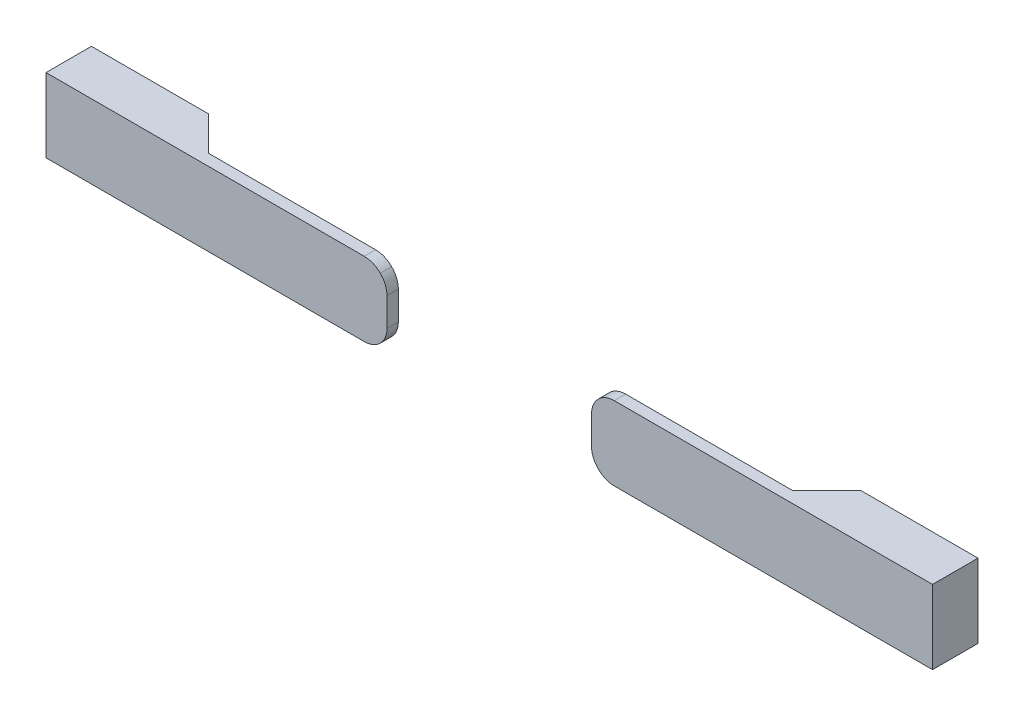
ISO-10303-21;
HEADER;
FILE_DESCRIPTION(('STEP AP214'),'2;1');
FILE_NAME('part.step','',(''),(''),'','','');
FILE_SCHEMA(('AUTOMOTIVE_DESIGN { 1 0 10303 214 1 1 1 1 }'));
ENDSEC;
DATA;
#1=APPLICATION_CONTEXT('core data for automotive mechanical design processes');
#2=APPLICATION_PROTOCOL_DEFINITION('international standard','automotive_design',2000,#1);
#3=PRODUCT_CONTEXT('',#1,'mechanical');
#4=PRODUCT('Part','Part','',(#3));
#5=PRODUCT_RELATED_PRODUCT_CATEGORY('part','',(#4));
#6=PRODUCT_DEFINITION_FORMATION('','',#4);
#7=PRODUCT_DEFINITION_CONTEXT('part definition',#1,'design');
#8=PRODUCT_DEFINITION('design','',#6,#7);
#9=PRODUCT_DEFINITION_SHAPE('','',#8);
#10=(LENGTH_UNIT() NAMED_UNIT(*) SI_UNIT(.MILLI.,.METRE.));
#11=(NAMED_UNIT(*) PLANE_ANGLE_UNIT() SI_UNIT($,.RADIAN.));
#12=(NAMED_UNIT(*) SI_UNIT($,.STERADIAN.) SOLID_ANGLE_UNIT());
#13=UNCERTAINTY_MEASURE_WITH_UNIT(LENGTH_MEASURE(1.E-05),#10,'distance_accuracy_value','');
#14=(GEOMETRIC_REPRESENTATION_CONTEXT(3) GLOBAL_UNCERTAINTY_ASSIGNED_CONTEXT((#13)) GLOBAL_UNIT_ASSIGNED_CONTEXT((#10,
#11,#12)) REPRESENTATION_CONTEXT('',''));
#15=CARTESIAN_POINT('',(0.,0.,0.));
#16=DIRECTION('',(0.,0.,1.));
#17=DIRECTION('',(1.,0.,0.));
#18=AXIS2_PLACEMENT_3D('',#15,#16,#17);
#19=CARTESIAN_POINT('',(1.1,-0.125,0.));
#20=DIRECTION('',(0.,0.,1.));
#21=DIRECTION('',(-0.707106781186548,-0.707106781186548,0.));
#22=AXIS2_PLACEMENT_3D('',#19,#20,#21);
#23=CYLINDRICAL_SURFACE('',#22,0.2);
#24=DIRECTION('',(0.,0.,1.));
#25=VECTOR('',#24,1.);
#26=CARTESIAN_POINT('',(0.95857864376269,-0.26642135623731,0.));
#27=LINE('',#26,#25);
#28=CARTESIAN_POINT('',(0.958578643762691,-0.26642135623731,0.3));
#29=VERTEX_POINT('',#28);
#30=CARTESIAN_POINT('',(0.958578643762691,-0.26642135623731,0.4));
#31=VERTEX_POINT('',#30);
#32=EDGE_CURVE('P0_E195',#29,#31,#27,.T.);
#33=ORIENTED_EDGE('',*,*,#32,.F.);
#34=CARTESIAN_POINT('',(1.1,-0.125,0.3));
#35=DIRECTION('',(0.,0.,1.));
#36=DIRECTION('',(-0.707106781186548,-0.707106781186548,0.));
#37=AXIS2_PLACEMENT_3D('',#34,#35,#36);
#38=CIRCLE('',#37,0.2);
#39=CARTESIAN_POINT('',(1.1,-0.325,0.3));
#40=VERTEX_POINT('',#39);
#41=EDGE_CURVE('P0_E11',#29,#40,#38,.T.);
#42=ORIENTED_EDGE('',*,*,#41,.T.);
#43=DIRECTION('',(0.,0.,1.));
#44=VECTOR('',#43,1.);
#45=CARTESIAN_POINT('',(1.1,-0.325,0.));
#46=LINE('',#45,#44);
#47=CARTESIAN_POINT('',(1.1,-0.325,0.4));
#48=VERTEX_POINT('',#47);
#49=EDGE_CURVE('P0_E156',#40,#48,#46,.T.);
#50=ORIENTED_EDGE('',*,*,#49,.T.);
#51=CARTESIAN_POINT('',(1.1,-0.125,0.4));
#52=DIRECTION('',(0.,0.,-1.));
#53=DIRECTION('',(-0.707106781186548,-0.707106781186548,0.));
#54=AXIS2_PLACEMENT_3D('',#51,#52,#53);
#55=CIRCLE('',#54,0.2);
#56=EDGE_CURVE('P0_E220',#48,#31,#55,.T.);
#57=ORIENTED_EDGE('',*,*,#56,.T.);
#58=EDGE_LOOP('',(#33,#42,#50,#57));
#59=FACE_BOUND('',#58,.T.);
#60=ADVANCED_FACE('P0_F16',(#59),#23,.T.);
#61=CARTESIAN_POINT('',(2.868307681883,-0.325,0.3));
#62=DIRECTION('',(0.,0.,1.));
#63=DIRECTION('',(1.,0.,0.));
#64=AXIS2_PLACEMENT_3D('',#61,#62,#63);
#65=PLANE('',#64);
#66=CARTESIAN_POINT('',(1.1,-0.125,0.3));
#67=DIRECTION('',(0.,0.,1.));
#68=DIRECTION('',(-0.707106781186548,-0.707106781186548,0.));
#69=AXIS2_PLACEMENT_3D('',#66,#67,#68);
#70=CIRCLE('',#69,0.2);
#71=CARTESIAN_POINT('',(0.9,-0.125,0.3));
#72=VERTEX_POINT('',#71);
#73=EDGE_CURVE('P0_E323',#72,#29,#70,.T.);
#74=ORIENTED_EDGE('',*,*,#73,.F.);
#75=DIRECTION('',(0.,-1.,0.));
#76=VECTOR('',#75,1.);
#77=CARTESIAN_POINT('',(0.9,0.,0.3));
#78=LINE('',#77,#76);
#79=CARTESIAN_POINT('',(0.9,0.125,0.3));
#80=VERTEX_POINT('',#79);
#81=EDGE_CURVE('P0_E27',#80,#72,#78,.T.);
#82=ORIENTED_EDGE('',*,*,#81,.F.);
#83=CARTESIAN_POINT('',(1.1,0.125,0.3));
#84=DIRECTION('',(0.,0.,1.));
#85=DIRECTION('',(-0.707106781186548,0.707106781186548,0.));
#86=AXIS2_PLACEMENT_3D('',#83,#84,#85);
#87=CIRCLE('',#86,0.2);
#88=CARTESIAN_POINT('',(0.958578643762691,0.26642135623731,0.3));
#89=VERTEX_POINT('',#88);
#90=EDGE_CURVE('P0_E159',#89,#80,#87,.T.);
#91=ORIENTED_EDGE('',*,*,#90,.F.);
#92=CARTESIAN_POINT('',(1.1,0.125,0.3));
#93=DIRECTION('',(0.,0.,1.));
#94=DIRECTION('',(-0.707106781186548,0.707106781186548,0.));
#95=AXIS2_PLACEMENT_3D('',#92,#93,#94);
#96=CIRCLE('',#95,0.2);
#97=CARTESIAN_POINT('',(1.1,0.325,0.3));
#98=VERTEX_POINT('',#97);
#99=EDGE_CURVE('P0_E152',#98,#89,#96,.T.);
#100=ORIENTED_EDGE('',*,*,#99,.F.);
#101=DIRECTION('',(-1.,0.,0.));
#102=VECTOR('',#101,1.);
#103=CARTESIAN_POINT('',(3.384153840942,0.325,0.3));
#104=LINE('',#103,#102);
#105=CARTESIAN_POINT('',(2.568307681883,0.325,0.3));
#106=VERTEX_POINT('',#105);
#107=EDGE_CURVE('P0_E139',#106,#98,#104,.T.);
#108=ORIENTED_EDGE('',*,*,#107,.F.);
#109=DIRECTION('',(0.,1.,0.));
#110=VECTOR('',#109,1.);
#111=CARTESIAN_POINT('',(2.568307681883,-0.325,0.3));
#112=LINE('',#111,#110);
#113=CARTESIAN_POINT('',(2.568307681883,-0.325,0.3));
#114=VERTEX_POINT('',#113);
#115=EDGE_CURVE('P0_E181',#114,#106,#112,.T.);
#116=ORIENTED_EDGE('',*,*,#115,.F.);
#117=DIRECTION('',(1.,0.,0.));
#118=VECTOR('',#117,1.);
#119=CARTESIAN_POINT('',(2.246653840942,-0.325,0.3));
#120=LINE('',#119,#118);
#121=EDGE_CURVE('P0_E184',#40,#114,#120,.T.);
#122=ORIENTED_EDGE('',*,*,#121,.F.);
#123=ORIENTED_EDGE('',*,*,#41,.F.);
#124=EDGE_LOOP('',(#74,#82,#91,#100,#108,#116,#122,#123));
#125=FACE_BOUND('',#124,.T.);
#126=ADVANCED_FACE('P0_F157',(#125),#65,.F.);
#127=CARTESIAN_POINT('',(0.9,0.325,0.));
#128=DIRECTION('',(-1.,0.,0.));
#129=DIRECTION('',(0.,0.,1.));
#130=AXIS2_PLACEMENT_3D('',#127,#128,#129);
#131=PLANE('',#130);
#132=DIRECTION('',(0.,0.,-1.));
#133=VECTOR('',#132,1.);
#134=CARTESIAN_POINT('',(0.9,-0.125,0.));
#135=LINE('',#134,#133);
#136=CARTESIAN_POINT('',(0.9,-0.125,0.4));
#137=VERTEX_POINT('',#136);
#138=EDGE_CURVE('P0_E163',#137,#72,#135,.T.);
#139=ORIENTED_EDGE('',*,*,#138,.F.);
#140=DIRECTION('',(0.,-1.,0.));
#141=VECTOR('',#140,1.);
#142=CARTESIAN_POINT('',(0.9,-0.325,0.4));
#143=LINE('',#142,#141);
#144=CARTESIAN_POINT('',(0.9,0.125,0.4));
#145=VERTEX_POINT('',#144);
#146=EDGE_CURVE('P0_E191',#145,#137,#143,.T.);
#147=ORIENTED_EDGE('',*,*,#146,.F.);
#148=DIRECTION('',(0.,0.,1.));
#149=VECTOR('',#148,1.);
#150=CARTESIAN_POINT('',(0.9,0.125,0.));
#151=LINE('',#150,#149);
#152=EDGE_CURVE('P0_E225',#80,#145,#151,.T.);
#153=ORIENTED_EDGE('',*,*,#152,.F.);
#154=ORIENTED_EDGE('',*,*,#81,.T.);
#155=EDGE_LOOP('',(#139,#147,#153,#154));
#156=FACE_BOUND('',#155,.T.);
#157=ADVANCED_FACE('P0_F408',(#156),#131,.T.);
#158=CARTESIAN_POINT('',(1.1,0.125,0.));
#159=DIRECTION('',(0.,0.,1.));
#160=DIRECTION('',(-0.707106781186548,0.707106781186548,0.));
#161=AXIS2_PLACEMENT_3D('',#158,#159,#160);
#162=CYLINDRICAL_SURFACE('',#161,0.2);
#163=DIRECTION('',(0.,0.,1.));
#164=VECTOR('',#163,1.);
#165=CARTESIAN_POINT('',(0.95857864376269,0.26642135623731,0.));
#166=LINE('',#165,#164);
#167=CARTESIAN_POINT('',(0.958578643762691,0.26642135623731,0.4));
#168=VERTEX_POINT('',#167);
#169=EDGE_CURVE('P0_E162',#89,#168,#166,.T.);
#170=ORIENTED_EDGE('',*,*,#169,.F.);
#171=ORIENTED_EDGE('',*,*,#90,.T.);
#172=ORIENTED_EDGE('',*,*,#152,.T.);
#173=CARTESIAN_POINT('',(1.1,0.125,0.4));
#174=DIRECTION('',(0.,0.,-1.));
#175=DIRECTION('',(-0.707106781186548,0.707106781186548,0.));
#176=AXIS2_PLACEMENT_3D('',#173,#174,#175);
#177=CIRCLE('',#176,0.2);
#178=EDGE_CURVE('P0_E188',#145,#168,#177,.T.);
#179=ORIENTED_EDGE('',*,*,#178,.T.);
#180=EDGE_LOOP('',(#170,#171,#172,#179));
#181=FACE_BOUND('',#180,.T.);
#182=ADVANCED_FACE('P0_F410',(#181),#162,.T.);
#183=CARTESIAN_POINT('',(2.718307681883,-0.325,0.15));
#184=DIRECTION('',(-0.707106781186548,0.,-0.707106781186548));
#185=DIRECTION('',(-0.707106781186548,0.,0.707106781186548));
#186=AXIS2_PLACEMENT_3D('',#183,#184,#185);
#187=PLANE('',#186);
#188=DIRECTION('',(-0.707106781186548,0.,0.707106781186548));
#189=VECTOR('',#188,1.);
#190=CARTESIAN_POINT('',(2.482480761413,-0.325,0.385826920471));
#191=LINE('',#190,#189);
#192=CARTESIAN_POINT('',(2.868307681883,-0.325,0.));
#193=VERTEX_POINT('',#192);
#194=EDGE_CURVE('P0_E20',#193,#114,#191,.T.);
#195=ORIENTED_EDGE('',*,*,#194,.T.);
#196=ORIENTED_EDGE('',*,*,#115,.T.);
#197=DIRECTION('',(0.707106781186548,0.,-0.707106781186548));
#198=VECTOR('',#197,1.);
#199=CARTESIAN_POINT('',(3.051230761413,0.325,-0.182923079529));
#200=LINE('',#199,#198);
#201=CARTESIAN_POINT('',(2.868307681883,0.325,0.));
#202=VERTEX_POINT('',#201);
#203=EDGE_CURVE('P0_E145',#106,#202,#200,.T.);
#204=ORIENTED_EDGE('',*,*,#203,.T.);
#205=DIRECTION('',(0.,1.,0.));
#206=VECTOR('',#205,1.);
#207=CARTESIAN_POINT('',(2.868307681883,-0.1625,0.));
#208=LINE('',#207,#206);
#209=EDGE_CURVE('P0_E91',#193,#202,#208,.T.);
#210=ORIENTED_EDGE('',*,*,#209,.F.);
#211=EDGE_LOOP('',(#195,#196,#204,#210));
#212=FACE_BOUND('',#211,.T.);
#213=ADVANCED_FACE('P0_F236',(#212),#187,.T.);
#214=CARTESIAN_POINT('',(2.713869469039,0.,0.));
#215=DIRECTION('',(0.,0.,1.));
#216=DIRECTION('',(1.,0.,0.));
#217=AXIS2_PLACEMENT_3D('',#214,#215,#216);
#218=PLANE('',#217);
#219=ORIENTED_EDGE('',*,*,#209,.T.);
#220=DIRECTION('',(1.,0.,0.));
#221=VECTOR('',#220,1.);
#222=CARTESIAN_POINT('',(1.625,0.325,0.));
#223=LINE('',#222,#221);
#224=CARTESIAN_POINT('',(3.9,0.325,0.));
#225=VERTEX_POINT('',#224);
#226=EDGE_CURVE('P0_E226',#202,#225,#223,.T.);
#227=ORIENTED_EDGE('',*,*,#226,.T.);
#228=DIRECTION('',(0.,-1.,0.));
#229=VECTOR('',#228,1.);
#230=CARTESIAN_POINT('',(3.9,0.325,0.));
#231=LINE('',#230,#229);
#232=CARTESIAN_POINT('',(3.9,-0.325,0.));
#233=VERTEX_POINT('',#232);
#234=EDGE_CURVE('P0_E75',#225,#233,#231,.T.);
#235=ORIENTED_EDGE('',*,*,#234,.T.);
#236=DIRECTION('',(-1.,0.,0.));
#237=VECTOR('',#236,1.);
#238=CARTESIAN_POINT('',(3.9,-0.325,0.));
#239=LINE('',#238,#237);
#240=EDGE_CURVE('P0_E177',#233,#193,#239,.T.);
#241=ORIENTED_EDGE('',*,*,#240,.T.);
#242=EDGE_LOOP('',(#219,#227,#235,#241));
#243=FACE_BOUND('',#242,.T.);
#244=ADVANCED_FACE('P0_F232',(#243),#218,.F.);
#245=CARTESIAN_POINT('',(3.9,0.325,0.));
#246=DIRECTION('',(0.,1.,0.));
#247=DIRECTION('',(1.,0.,0.));
#248=AXIS2_PLACEMENT_3D('',#245,#246,#247);
#249=PLANE('',#248);
#250=DIRECTION('',(0.,0.,-1.));
#251=VECTOR('',#250,1.);
#252=CARTESIAN_POINT('',(1.1,0.325,0.));
#253=LINE('',#252,#251);
#254=CARTESIAN_POINT('',(1.1,0.325,0.4));
#255=VERTEX_POINT('',#254);
#256=EDGE_CURVE('P0_E142',#255,#98,#253,.T.);
#257=ORIENTED_EDGE('',*,*,#256,.F.);
#258=DIRECTION('',(-1.,0.,0.));
#259=VECTOR('',#258,1.);
#260=CARTESIAN_POINT('',(0.9,0.325,0.4));
#261=LINE('',#260,#259);
#262=CARTESIAN_POINT('',(3.9,0.325,0.4));
#263=VERTEX_POINT('',#262);
#264=EDGE_CURVE('P0_E192',#263,#255,#261,.T.);
#265=ORIENTED_EDGE('',*,*,#264,.F.);
#266=DIRECTION('',(0.,0.,1.));
#267=VECTOR('',#266,1.);
#268=CARTESIAN_POINT('',(3.9,0.325,0.));
#269=LINE('',#268,#267);
#270=EDGE_CURVE('P0_E200',#225,#263,#269,.T.);
#271=ORIENTED_EDGE('',*,*,#270,.F.);
#272=ORIENTED_EDGE('',*,*,#226,.F.);
#273=ORIENTED_EDGE('',*,*,#203,.F.);
#274=ORIENTED_EDGE('',*,*,#107,.T.);
#275=EDGE_LOOP('',(#257,#265,#271,#272,#273,#274));
#276=FACE_BOUND('',#275,.T.);
#277=ADVANCED_FACE('P0_F141',(#276),#249,.T.);
#278=CARTESIAN_POINT('',(2.4,0.,0.4));
#279=DIRECTION('',(0.,0.,1.));
#280=DIRECTION('',(1.,0.,0.));
#281=AXIS2_PLACEMENT_3D('',#278,#279,#280);
#282=PLANE('',#281);
#283=ORIENTED_EDGE('',*,*,#56,.F.);
#284=DIRECTION('',(1.,0.,0.));
#285=VECTOR('',#284,1.);
#286=CARTESIAN_POINT('',(3.9,-0.325,0.4));
#287=LINE('',#286,#285);
#288=CARTESIAN_POINT('',(3.9,-0.325,0.4));
#289=VERTEX_POINT('',#288);
#290=EDGE_CURVE('P0_E201',#48,#289,#287,.T.);
#291=ORIENTED_EDGE('',*,*,#290,.T.);
#292=DIRECTION('',(0.,1.,0.));
#293=VECTOR('',#292,1.);
#294=CARTESIAN_POINT('',(3.9,0.325,0.4));
#295=LINE('',#294,#293);
#296=EDGE_CURVE('P0_E175',#289,#263,#295,.T.);
#297=ORIENTED_EDGE('',*,*,#296,.T.);
#298=ORIENTED_EDGE('',*,*,#264,.T.);
#299=CARTESIAN_POINT('',(1.1,0.125,0.4));
#300=DIRECTION('',(0.,0.,-1.));
#301=DIRECTION('',(-0.707106781186548,0.707106781186548,0.));
#302=AXIS2_PLACEMENT_3D('',#299,#300,#301);
#303=CIRCLE('',#302,0.2);
#304=EDGE_CURVE('P0_E154',#168,#255,#303,.T.);
#305=ORIENTED_EDGE('',*,*,#304,.F.);
#306=ORIENTED_EDGE('',*,*,#178,.F.);
#307=ORIENTED_EDGE('',*,*,#146,.T.);
#308=CARTESIAN_POINT('',(1.1,-0.125,0.4));
#309=DIRECTION('',(0.,0.,-1.));
#310=DIRECTION('',(-0.707106781186548,-0.707106781186548,0.));
#311=AXIS2_PLACEMENT_3D('',#308,#309,#310);
#312=CIRCLE('',#311,0.2);
#313=EDGE_CURVE('P0_E171',#31,#137,#312,.T.);
#314=ORIENTED_EDGE('',*,*,#313,.F.);
#315=EDGE_LOOP('',(#283,#291,#297,#298,#305,#306,#307,#314));
#316=FACE_BOUND('',#315,.T.);
#317=ADVANCED_FACE('P0_F405',(#316),#282,.T.);
#318=CARTESIAN_POINT('',(3.9,-0.325,0.));
#319=DIRECTION('',(1.,0.,0.));
#320=DIRECTION('',(0.,1.,0.));
#321=AXIS2_PLACEMENT_3D('',#318,#319,#320);
#322=PLANE('',#321);
#323=ORIENTED_EDGE('',*,*,#234,.F.);
#324=ORIENTED_EDGE('',*,*,#270,.T.);
#325=ORIENTED_EDGE('',*,*,#296,.F.);
#326=DIRECTION('',(0.,0.,1.));
#327=VECTOR('',#326,1.);
#328=CARTESIAN_POINT('',(3.9,-0.325,0.));
#329=LINE('',#328,#327);
#330=EDGE_CURVE('P0_E180',#233,#289,#329,.T.);
#331=ORIENTED_EDGE('',*,*,#330,.F.);
#332=EDGE_LOOP('',(#323,#324,#325,#331));
#333=FACE_BOUND('',#332,.T.);
#334=ADVANCED_FACE('P0_F240',(#333),#322,.T.);
#335=CARTESIAN_POINT('',(1.625,-0.325,0.));
#336=DIRECTION('',(0.,-1.,0.));
#337=DIRECTION('',(0.,0.,-1.));
#338=AXIS2_PLACEMENT_3D('',#335,#336,#337);
#339=PLANE('',#338);
#340=ORIENTED_EDGE('',*,*,#49,.F.);
#341=ORIENTED_EDGE('',*,*,#121,.T.);
#342=ORIENTED_EDGE('',*,*,#194,.F.);
#343=ORIENTED_EDGE('',*,*,#240,.F.);
#344=ORIENTED_EDGE('',*,*,#330,.T.);
#345=ORIENTED_EDGE('',*,*,#290,.F.);
#346=EDGE_LOOP('',(#340,#341,#342,#343,#344,#345));
#347=FACE_BOUND('',#346,.T.);
#348=ADVANCED_FACE('P0_F243',(#347),#339,.T.);
#349=CARTESIAN_POINT('',(1.1,0.125,0.));
#350=DIRECTION('',(0.,0.,1.));
#351=DIRECTION('',(-0.707106781186548,0.707106781186548,0.));
#352=AXIS2_PLACEMENT_3D('',#349,#350,#351);
#353=CYLINDRICAL_SURFACE('',#352,0.2);
#354=ORIENTED_EDGE('',*,*,#99,.T.);
#355=ORIENTED_EDGE('',*,*,#169,.T.);
#356=ORIENTED_EDGE('',*,*,#304,.T.);
#357=ORIENTED_EDGE('',*,*,#256,.T.);
#358=EDGE_LOOP('',(#354,#355,#356,#357));
#359=FACE_BOUND('',#358,.T.);
#360=ADVANCED_FACE('P0_F18',(#359),#353,.T.);
#361=CARTESIAN_POINT('',(1.1,-0.125,0.));
#362=DIRECTION('',(0.,0.,1.));
#363=DIRECTION('',(-0.707106781186548,-0.707106781186548,0.));
#364=AXIS2_PLACEMENT_3D('',#361,#362,#363);
#365=CYLINDRICAL_SURFACE('',#364,0.2);
#366=ORIENTED_EDGE('',*,*,#73,.T.);
#367=ORIENTED_EDGE('',*,*,#32,.T.);
#368=ORIENTED_EDGE('',*,*,#313,.T.);
#369=ORIENTED_EDGE('',*,*,#138,.T.);
#370=EDGE_LOOP('',(#366,#367,#368,#369));
#371=FACE_BOUND('',#370,.T.);
#372=ADVANCED_FACE('P0_F402',(#371),#365,.T.);
#373=CLOSED_SHELL('',(#60,#126,#157,#182,#213,#244,#277,#317,#334,#348,#360,#372));
#374=MANIFOLD_SOLID_BREP('P0_B1',#373);
#375=CARTESIAN_POINT('',(-1.1,0.125,0.));
#376=DIRECTION('',(0.,0.,1.));
#377=DIRECTION('',(0.707106781186548,0.707106781186548,0.));
#378=AXIS2_PLACEMENT_3D('',#375,#376,#377);
#379=CYLINDRICAL_SURFACE('',#378,0.2);
#380=DIRECTION('',(0.,0.,1.));
#381=VECTOR('',#380,1.);
#382=CARTESIAN_POINT('',(-0.95857864376269,0.26642135623731,0.));
#383=LINE('',#382,#381);
#384=CARTESIAN_POINT('',(-0.958578643762691,0.26642135623731,0.3));
#385=VERTEX_POINT('',#384);
#386=CARTESIAN_POINT('',(-0.958578643762691,0.26642135623731,0.4));
#387=VERTEX_POINT('',#386);
#388=EDGE_CURVE('P1_E174',#385,#387,#383,.T.);
#389=ORIENTED_EDGE('',*,*,#388,.F.);
#390=CARTESIAN_POINT('',(-1.1,0.125,0.3));
#391=DIRECTION('',(0.,0.,1.));
#392=DIRECTION('',(0.707106781186548,0.707106781186548,0.));
#393=AXIS2_PLACEMENT_3D('',#390,#391,#392);
#394=CIRCLE('',#393,0.2);
#395=CARTESIAN_POINT('',(-1.1,0.325,0.3));
#396=VERTEX_POINT('',#395);
#397=EDGE_CURVE('P1_E27',#385,#396,#394,.T.);
#398=ORIENTED_EDGE('',*,*,#397,.T.);
#399=DIRECTION('',(0.,0.,1.));
#400=VECTOR('',#399,1.);
#401=CARTESIAN_POINT('',(-1.1,0.325,0.));
#402=LINE('',#401,#400);
#403=CARTESIAN_POINT('',(-1.1,0.325,0.4));
#404=VERTEX_POINT('',#403);
#405=EDGE_CURVE('P1_E11',#396,#404,#402,.T.);
#406=ORIENTED_EDGE('',*,*,#405,.T.);
#407=CARTESIAN_POINT('',(-1.1,0.125,0.4));
#408=DIRECTION('',(0.,0.,-1.));
#409=DIRECTION('',(0.707106781186548,0.707106781186548,0.));
#410=AXIS2_PLACEMENT_3D('',#407,#408,#409);
#411=CIRCLE('',#410,0.2);
#412=EDGE_CURVE('P1_E81',#404,#387,#411,.T.);
#413=ORIENTED_EDGE('',*,*,#412,.T.);
#414=EDGE_LOOP('',(#389,#398,#406,#413));
#415=FACE_BOUND('',#414,.T.);
#416=ADVANCED_FACE('P1_F16',(#415),#379,.T.);
#417=CARTESIAN_POINT('',(-3.9,0.325,0.));
#418=DIRECTION('',(0.,-1.,0.));
#419=DIRECTION('',(0.,0.,-1.));
#420=AXIS2_PLACEMENT_3D('',#417,#418,#419);
#421=PLANE('',#420);
#422=ORIENTED_EDGE('',*,*,#405,.F.);
#423=DIRECTION('',(-1.,0.,0.));
#424=VECTOR('',#423,1.);
#425=CARTESIAN_POINT('',(-0.515846159058,0.325,0.3));
#426=LINE('',#425,#424);
#427=CARTESIAN_POINT('',(-2.568307681883,0.325,0.3));
#428=VERTEX_POINT('',#427);
#429=EDGE_CURVE('P1_E117',#396,#428,#426,.T.);
#430=ORIENTED_EDGE('',*,*,#429,.T.);
#431=DIRECTION('',(0.707106781186548,0.,0.707106781186548));
#432=VECTOR('',#431,1.);
#433=CARTESIAN_POINT('',(-3.051230761413,0.325,-0.182923079529));
#434=LINE('',#433,#432);
#435=CARTESIAN_POINT('',(-2.868307681883,0.325,0.));
#436=VERTEX_POINT('',#435);
#437=EDGE_CURVE('P1_E149',#436,#428,#434,.T.);
#438=ORIENTED_EDGE('',*,*,#437,.F.);
#439=DIRECTION('',(-1.,0.,0.));
#440=VECTOR('',#439,1.);
#441=CARTESIAN_POINT('',(-1.625,0.325,0.));
#442=LINE('',#441,#440);
#443=CARTESIAN_POINT('',(-3.9,0.325,0.));
#444=VERTEX_POINT('',#443);
#445=EDGE_CURVE('P1_E209',#436,#444,#442,.T.);
#446=ORIENTED_EDGE('',*,*,#445,.T.);
#447=DIRECTION('',(0.,0.,1.));
#448=VECTOR('',#447,1.);
#449=CARTESIAN_POINT('',(-3.9,0.325,0.));
#450=LINE('',#449,#448);
#451=CARTESIAN_POINT('',(-3.9,0.325,0.4));
#452=VERTEX_POINT('',#451);
#453=EDGE_CURVE('P1_E155',#444,#452,#450,.T.);
#454=ORIENTED_EDGE('',*,*,#453,.T.);
#455=DIRECTION('',(-1.,0.,0.));
#456=VECTOR('',#455,1.);
#457=CARTESIAN_POINT('',(-3.9,0.325,0.4));
#458=LINE('',#457,#456);
#459=EDGE_CURVE('P1_E169',#404,#452,#458,.T.);
#460=ORIENTED_EDGE('',*,*,#459,.F.);
#461=EDGE_LOOP('',(#422,#430,#438,#446,#454,#460));
#462=FACE_BOUND('',#461,.T.);
#463=ADVANCED_FACE('P1_F273',(#462),#421,.F.);
#464=CARTESIAN_POINT('',(2.868307681883,-0.325,0.3));
#465=DIRECTION('',(0.,0.,1.));
#466=DIRECTION('',(1.,0.,0.));
#467=AXIS2_PLACEMENT_3D('',#464,#465,#466);
#468=PLANE('',#467);
#469=CARTESIAN_POINT('',(-1.1,0.125,0.3));
#470=DIRECTION('',(0.,0.,1.));
#471=DIRECTION('',(0.707106781186548,0.707106781186548,0.));
#472=AXIS2_PLACEMENT_3D('',#469,#470,#471);
#473=CIRCLE('',#472,0.2);
#474=CARTESIAN_POINT('',(-0.9,0.125,0.3));
#475=VERTEX_POINT('',#474);
#476=EDGE_CURVE('P1_E170',#475,#385,#473,.T.);
#477=ORIENTED_EDGE('',*,*,#476,.F.);
#478=DIRECTION('',(0.,1.,0.));
#479=VECTOR('',#478,1.);
#480=CARTESIAN_POINT('',(-0.9,-0.325,0.3));
#481=LINE('',#480,#479);
#482=CARTESIAN_POINT('',(-0.9,-0.125,0.3));
#483=VERTEX_POINT('',#482);
#484=EDGE_CURVE('P1_E220',#483,#475,#481,.T.);
#485=ORIENTED_EDGE('',*,*,#484,.F.);
#486=CARTESIAN_POINT('',(-1.1,-0.125,0.3));
#487=DIRECTION('',(0.,0.,1.));
#488=DIRECTION('',(0.707106781186548,-0.707106781186548,0.));
#489=AXIS2_PLACEMENT_3D('',#486,#487,#488);
#490=CIRCLE('',#489,0.2);
#491=CARTESIAN_POINT('',(-0.958578643762691,-0.26642135623731,0.3));
#492=VERTEX_POINT('',#491);
#493=EDGE_CURVE('P1_E136',#492,#483,#490,.T.);
#494=ORIENTED_EDGE('',*,*,#493,.F.);
#495=CARTESIAN_POINT('',(-1.1,-0.125,0.3));
#496=DIRECTION('',(0.,0.,1.));
#497=DIRECTION('',(0.707106781186548,-0.707106781186548,0.));
#498=AXIS2_PLACEMENT_3D('',#495,#496,#497);
#499=CIRCLE('',#498,0.2);
#500=CARTESIAN_POINT('',(-1.1,-0.325,0.3));
#501=VERTEX_POINT('',#500);
#502=EDGE_CURVE('P1_E131',#501,#492,#499,.T.);
#503=ORIENTED_EDGE('',*,*,#502,.F.);
#504=DIRECTION('',(1.,0.,0.));
#505=VECTOR('',#504,1.);
#506=CARTESIAN_POINT('',(0.621653840942,-0.325,0.3));
#507=LINE('',#506,#505);
#508=CARTESIAN_POINT('',(-2.568307681883,-0.325,0.3));
#509=VERTEX_POINT('',#508);
#510=EDGE_CURVE('P1_E124',#509,#501,#507,.T.);
#511=ORIENTED_EDGE('',*,*,#510,.F.);
#512=DIRECTION('',(0.,-1.,0.));
#513=VECTOR('',#512,1.);
#514=CARTESIAN_POINT('',(-2.568307681883,-0.325,0.3));
#515=LINE('',#514,#513);
#516=EDGE_CURVE('P1_E20',#428,#509,#515,.T.);
#517=ORIENTED_EDGE('',*,*,#516,.F.);
#518=ORIENTED_EDGE('',*,*,#429,.F.);
#519=ORIENTED_EDGE('',*,*,#397,.F.);
#520=EDGE_LOOP('',(#477,#485,#494,#503,#511,#517,#518,#519));
#521=FACE_BOUND('',#520,.T.);
#522=ADVANCED_FACE('P1_F126',(#521),#468,.F.);
#523=CARTESIAN_POINT('',(-1.1,-0.125,0.));
#524=DIRECTION('',(0.,0.,1.));
#525=DIRECTION('',(0.707106781186548,-0.707106781186548,0.));
#526=AXIS2_PLACEMENT_3D('',#523,#524,#525);
#527=CYLINDRICAL_SURFACE('',#526,0.2);
#528=DIRECTION('',(0.,0.,1.));
#529=VECTOR('',#528,1.);
#530=CARTESIAN_POINT('',(-0.95857864376269,-0.26642135623731,0.));
#531=LINE('',#530,#529);
#532=CARTESIAN_POINT('',(-0.958578643762691,-0.26642135623731,0.4));
#533=VERTEX_POINT('',#532);
#534=EDGE_CURVE('P1_E189',#492,#533,#531,.T.);
#535=ORIENTED_EDGE('',*,*,#534,.F.);
#536=ORIENTED_EDGE('',*,*,#493,.T.);
#537=DIRECTION('',(0.,0.,1.));
#538=VECTOR('',#537,1.);
#539=CARTESIAN_POINT('',(-0.9,-0.125,0.));
#540=LINE('',#539,#538);
#541=CARTESIAN_POINT('',(-0.9,-0.125,0.4));
#542=VERTEX_POINT('',#541);
#543=EDGE_CURVE('P1_E223',#483,#542,#540,.T.);
#544=ORIENTED_EDGE('',*,*,#543,.T.);
#545=CARTESIAN_POINT('',(-1.1,-0.125,0.4));
#546=DIRECTION('',(0.,0.,-1.));
#547=DIRECTION('',(0.707106781186548,-0.707106781186548,0.));
#548=AXIS2_PLACEMENT_3D('',#545,#546,#547);
#549=CIRCLE('',#548,0.2);
#550=EDGE_CURVE('P1_E137',#542,#533,#549,.T.);
#551=ORIENTED_EDGE('',*,*,#550,.T.);
#552=EDGE_LOOP('',(#535,#536,#544,#551));
#553=FACE_BOUND('',#552,.T.);
#554=ADVANCED_FACE('P1_F268',(#553),#527,.T.);
#555=CARTESIAN_POINT('',(-1.625,-0.325,0.));
#556=DIRECTION('',(0.,1.,0.));
#557=DIRECTION('',(1.,0.,0.));
#558=AXIS2_PLACEMENT_3D('',#555,#556,#557);
#559=PLANE('',#558);
#560=DIRECTION('',(0.,0.,-1.));
#561=VECTOR('',#560,1.);
#562=CARTESIAN_POINT('',(-1.1,-0.325,0.));
#563=LINE('',#562,#561);
#564=CARTESIAN_POINT('',(-1.1,-0.325,0.4));
#565=VERTEX_POINT('',#564);
#566=EDGE_CURVE('P1_E188',#565,#501,#563,.T.);
#567=ORIENTED_EDGE('',*,*,#566,.F.);
#568=DIRECTION('',(1.,0.,0.));
#569=VECTOR('',#568,1.);
#570=CARTESIAN_POINT('',(-0.9,-0.325,0.4));
#571=LINE('',#570,#569);
#572=CARTESIAN_POINT('',(-3.9,-0.325,0.4));
#573=VERTEX_POINT('',#572);
#574=EDGE_CURVE('P1_E183',#573,#565,#571,.T.);
#575=ORIENTED_EDGE('',*,*,#574,.F.);
#576=DIRECTION('',(0.,0.,1.));
#577=VECTOR('',#576,1.);
#578=CARTESIAN_POINT('',(-3.9,-0.325,0.));
#579=LINE('',#578,#577);
#580=CARTESIAN_POINT('',(-3.9,-0.325,0.));
#581=VERTEX_POINT('',#580);
#582=EDGE_CURVE('P1_E165',#581,#573,#579,.T.);
#583=ORIENTED_EDGE('',*,*,#582,.F.);
#584=DIRECTION('',(1.,0.,0.));
#585=VECTOR('',#584,1.);
#586=CARTESIAN_POINT('',(-3.9,-0.325,0.));
#587=LINE('',#586,#585);
#588=CARTESIAN_POINT('',(-2.868307681883,-0.325,0.));
#589=VERTEX_POINT('',#588);
#590=EDGE_CURVE('P1_E142',#581,#589,#587,.T.);
#591=ORIENTED_EDGE('',*,*,#590,.T.);
#592=DIRECTION('',(-0.707106781186548,0.,-0.707106781186548));
#593=VECTOR('',#592,1.);
#594=CARTESIAN_POINT('',(-2.482480761413,-0.325,0.385826920471));
#595=LINE('',#594,#593);
#596=EDGE_CURVE('P1_E139',#509,#589,#595,.T.);
#597=ORIENTED_EDGE('',*,*,#596,.F.);
#598=ORIENTED_EDGE('',*,*,#510,.T.);
#599=EDGE_LOOP('',(#567,#575,#583,#591,#597,#598));
#600=FACE_BOUND('',#599,.T.);
#601=ADVANCED_FACE('P1_F140',(#600),#559,.F.);
#602=CARTESIAN_POINT('',(-2.4,0.,0.4));
#603=DIRECTION('',(0.,0.,1.));
#604=DIRECTION('',(1.,0.,0.));
#605=AXIS2_PLACEMENT_3D('',#602,#603,#604);
#606=PLANE('',#605);
#607=ORIENTED_EDGE('',*,*,#412,.F.);
#608=ORIENTED_EDGE('',*,*,#459,.T.);
#609=DIRECTION('',(0.,-1.,0.));
#610=VECTOR('',#609,1.);
#611=CARTESIAN_POINT('',(-3.9,-0.325,0.4));
#612=LINE('',#611,#610);
#613=EDGE_CURVE('P1_E161',#452,#573,#612,.T.);
#614=ORIENTED_EDGE('',*,*,#613,.T.);
#615=ORIENTED_EDGE('',*,*,#574,.T.);
#616=CARTESIAN_POINT('',(-1.1,-0.125,0.4));
#617=DIRECTION('',(0.,0.,-1.));
#618=DIRECTION('',(0.707106781186548,-0.707106781186548,0.));
#619=AXIS2_PLACEMENT_3D('',#616,#617,#618);
#620=CIRCLE('',#619,0.2);
#621=EDGE_CURVE('P1_E184',#533,#565,#620,.T.);
#622=ORIENTED_EDGE('',*,*,#621,.F.);
#623=ORIENTED_EDGE('',*,*,#550,.F.);
#624=DIRECTION('',(0.,1.,0.));
#625=VECTOR('',#624,1.);
#626=CARTESIAN_POINT('',(-0.9,0.325,0.4));
#627=LINE('',#626,#625);
#628=CARTESIAN_POINT('',(-0.9,0.125,0.4));
#629=VERTEX_POINT('',#628);
#630=EDGE_CURVE('P1_E213',#542,#629,#627,.T.);
#631=ORIENTED_EDGE('',*,*,#630,.T.);
#632=CARTESIAN_POINT('',(-1.1,0.125,0.4));
#633=DIRECTION('',(0.,0.,-1.));
#634=DIRECTION('',(0.707106781186548,0.707106781186548,0.));
#635=AXIS2_PLACEMENT_3D('',#632,#633,#634);
#636=CIRCLE('',#635,0.2);
#637=EDGE_CURVE('P1_E180',#387,#629,#636,.T.);
#638=ORIENTED_EDGE('',*,*,#637,.F.);
#639=EDGE_LOOP('',(#607,#608,#614,#615,#622,#623,#631,#638));
#640=FACE_BOUND('',#639,.T.);
#641=ADVANCED_FACE('P1_F263',(#640),#606,.T.);
#642=CARTESIAN_POINT('',(-2.718307681883,-0.325,0.15));
#643=DIRECTION('',(0.707106781186548,0.,-0.707106781186548));
#644=DIRECTION('',(0.,-1.,0.));
#645=AXIS2_PLACEMENT_3D('',#642,#643,#644);
#646=PLANE('',#645);
#647=ORIENTED_EDGE('',*,*,#437,.T.);
#648=ORIENTED_EDGE('',*,*,#516,.T.);
#649=ORIENTED_EDGE('',*,*,#596,.T.);
#650=DIRECTION('',(0.,-1.,0.));
#651=VECTOR('',#650,1.);
#652=CARTESIAN_POINT('',(-2.868307681883,-0.1625,0.));
#653=LINE('',#652,#651);
#654=EDGE_CURVE('P1_E217',#436,#589,#653,.T.);
#655=ORIENTED_EDGE('',*,*,#654,.F.);
#656=EDGE_LOOP('',(#647,#648,#649,#655));
#657=FACE_BOUND('',#656,.T.);
#658=ADVANCED_FACE('P1_F148',(#657),#646,.T.);
#659=CARTESIAN_POINT('',(-3.9,-0.325,0.));
#660=DIRECTION('',(1.,0.,0.));
#661=DIRECTION('',(0.,1.,0.));
#662=AXIS2_PLACEMENT_3D('',#659,#660,#661);
#663=PLANE('',#662);
#664=DIRECTION('',(0.,-1.,0.));
#665=VECTOR('',#664,1.);
#666=CARTESIAN_POINT('',(-3.9,0.325,0.));
#667=LINE('',#666,#665);
#668=EDGE_CURVE('P1_E214',#444,#581,#667,.T.);
#669=ORIENTED_EDGE('',*,*,#668,.T.);
#670=ORIENTED_EDGE('',*,*,#582,.T.);
#671=ORIENTED_EDGE('',*,*,#613,.F.);
#672=ORIENTED_EDGE('',*,*,#453,.F.);
#673=EDGE_LOOP('',(#669,#670,#671,#672));
#674=FACE_BOUND('',#673,.T.);
#675=ADVANCED_FACE('P1_F247',(#674),#663,.F.);
#676=CARTESIAN_POINT('',(-0.9,-0.325,0.));
#677=DIRECTION('',(1.,0.,0.));
#678=DIRECTION('',(0.,-1.,0.));
#679=AXIS2_PLACEMENT_3D('',#676,#677,#678);
#680=PLANE('',#679);
#681=DIRECTION('',(0.,0.,-1.));
#682=VECTOR('',#681,1.);
#683=CARTESIAN_POINT('',(-0.9,0.125,0.));
#684=LINE('',#683,#682);
#685=EDGE_CURVE('P1_E228',#629,#475,#684,.T.);
#686=ORIENTED_EDGE('',*,*,#685,.F.);
#687=ORIENTED_EDGE('',*,*,#630,.F.);
#688=ORIENTED_EDGE('',*,*,#543,.F.);
#689=ORIENTED_EDGE('',*,*,#484,.T.);
#690=EDGE_LOOP('',(#686,#687,#688,#689));
#691=FACE_BOUND('',#690,.T.);
#692=ADVANCED_FACE('P1_F18',(#691),#680,.T.);
#693=CARTESIAN_POINT('',(-2.713869469039,0.,0.));
#694=DIRECTION('',(0.,0.,-1.));
#695=DIRECTION('',(0.,-1.,0.));
#696=AXIS2_PLACEMENT_3D('',#693,#694,#695);
#697=PLANE('',#696);
#698=ORIENTED_EDGE('',*,*,#654,.T.);
#699=ORIENTED_EDGE('',*,*,#590,.F.);
#700=ORIENTED_EDGE('',*,*,#668,.F.);
#701=ORIENTED_EDGE('',*,*,#445,.F.);
#702=EDGE_LOOP('',(#698,#699,#700,#701));
#703=FACE_BOUND('',#702,.T.);
#704=ADVANCED_FACE('P1_F251',(#703),#697,.T.);
#705=CARTESIAN_POINT('',(-1.1,-0.125,0.));
#706=DIRECTION('',(0.,0.,1.));
#707=DIRECTION('',(0.707106781186548,-0.707106781186548,0.));
#708=AXIS2_PLACEMENT_3D('',#705,#706,#707);
#709=CYLINDRICAL_SURFACE('',#708,0.2);
#710=ORIENTED_EDGE('',*,*,#502,.T.);
#711=ORIENTED_EDGE('',*,*,#534,.T.);
#712=ORIENTED_EDGE('',*,*,#621,.T.);
#713=ORIENTED_EDGE('',*,*,#566,.T.);
#714=EDGE_LOOP('',(#710,#711,#712,#713));
#715=FACE_BOUND('',#714,.T.);
#716=ADVANCED_FACE('P1_F270',(#715),#709,.T.);
#717=CARTESIAN_POINT('',(-1.1,0.125,0.));
#718=DIRECTION('',(0.,0.,1.));
#719=DIRECTION('',(0.707106781186548,0.707106781186548,0.));
#720=AXIS2_PLACEMENT_3D('',#717,#718,#719);
#721=CYLINDRICAL_SURFACE('',#720,0.2);
#722=ORIENTED_EDGE('',*,*,#476,.T.);
#723=ORIENTED_EDGE('',*,*,#388,.T.);
#724=ORIENTED_EDGE('',*,*,#637,.T.);
#725=ORIENTED_EDGE('',*,*,#685,.T.);
#726=EDGE_LOOP('',(#722,#723,#724,#725));
#727=FACE_BOUND('',#726,.T.);
#728=ADVANCED_FACE('P1_F261',(#727),#721,.T.);
#729=CLOSED_SHELL('',(#416,#463,#522,#554,#601,#641,#658,#675,#692,#704,#716,#728));
#730=MANIFOLD_SOLID_BREP('P1_B1',#729);
#731=ADVANCED_BREP_SHAPE_REPRESENTATION('',(#18,#374,#730),#14);
#732=SHAPE_DEFINITION_REPRESENTATION(#9,#731);
ENDSEC;
END-ISO-10303-21;
